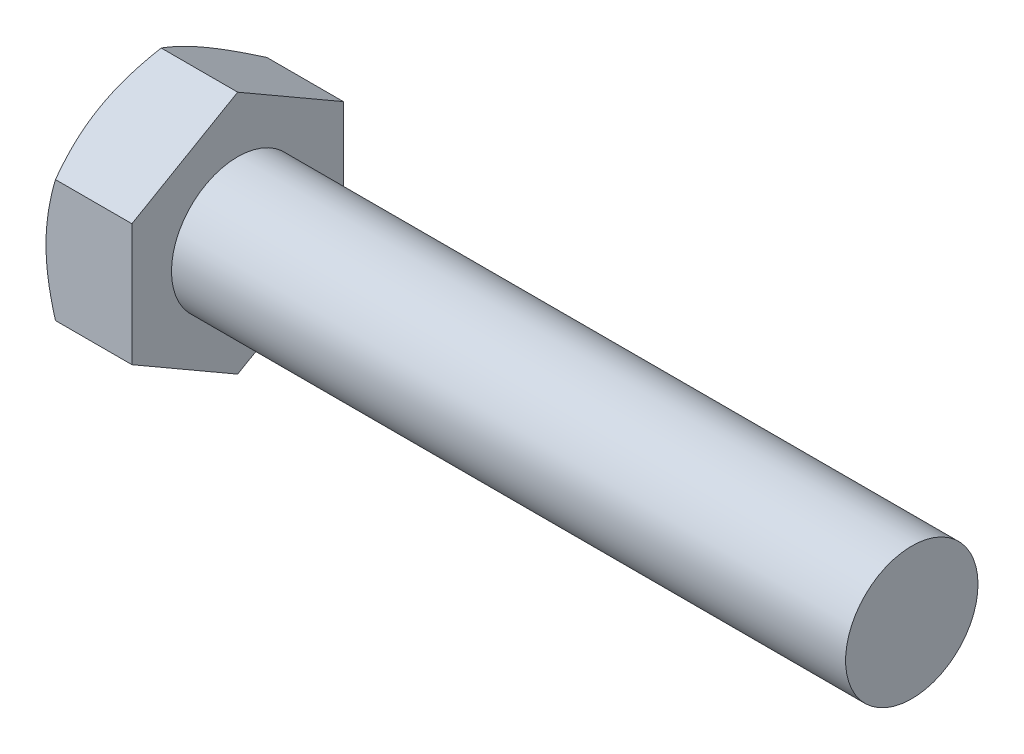
ISO-10303-21;
HEADER;
FILE_DESCRIPTION(('STEP AP214'),'2;1');
FILE_NAME('part.step','',(''),(''),'','','');
FILE_SCHEMA(('AUTOMOTIVE_DESIGN { 1 0 10303 214 1 1 1 1 }'));
ENDSEC;
DATA;
#1=APPLICATION_CONTEXT('core data for automotive mechanical design processes');
#2=APPLICATION_PROTOCOL_DEFINITION('international standard','automotive_design',2000,#1);
#3=PRODUCT_CONTEXT('',#1,'mechanical');
#4=PRODUCT('Part','Part','',(#3));
#5=PRODUCT_RELATED_PRODUCT_CATEGORY('part','',(#4));
#6=PRODUCT_DEFINITION_FORMATION('','',#4);
#7=PRODUCT_DEFINITION_CONTEXT('part definition',#1,'design');
#8=PRODUCT_DEFINITION('design','',#6,#7);
#9=PRODUCT_DEFINITION_SHAPE('','',#8);
#10=(LENGTH_UNIT() NAMED_UNIT(*) SI_UNIT(.MILLI.,.METRE.));
#11=(NAMED_UNIT(*) PLANE_ANGLE_UNIT() SI_UNIT($,.RADIAN.));
#12=(NAMED_UNIT(*) SI_UNIT($,.STERADIAN.) SOLID_ANGLE_UNIT());
#13=UNCERTAINTY_MEASURE_WITH_UNIT(LENGTH_MEASURE(1.E-05),#10,'distance_accuracy_value','');
#14=(GEOMETRIC_REPRESENTATION_CONTEXT(3) GLOBAL_UNCERTAINTY_ASSIGNED_CONTEXT((#13)) GLOBAL_UNIT_ASSIGNED_CONTEXT((#10,
#11,#12)) REPRESENTATION_CONTEXT('',''));
#15=CARTESIAN_POINT('',(0.,0.,0.));
#16=DIRECTION('',(0.,0.,1.));
#17=DIRECTION('',(1.,0.,0.));
#18=AXIS2_PLACEMENT_3D('',#15,#16,#17);
#19=CARTESIAN_POINT('',(-22.8203125,-3.66617420935412,6.35));
#20=DIRECTION('',(0.,0.,-1.));
#21=DIRECTION('',(0.,1.,0.));
#22=AXIS2_PLACEMENT_3D('',#19,#20,#21);
#23=PLANE('',#22);
#24=CARTESIAN_POINT('',(-19.6448084769885,-10.0051578251258,6.35));
#25=CARTESIAN_POINT('',(-19.7806472234139,-9.72641871453256,6.35));
#26=CARTESIAN_POINT('',(-19.9152281142947,-9.44705632305443,6.35));
#27=CARTESIAN_POINT('',(-20.1811696423704,-8.88675404130045,6.35));
#28=CARTESIAN_POINT('',(-20.3125298009689,-8.60581392410908,6.35));
#29=CARTESIAN_POINT('',(-20.5719527378285,-8.04065222508161,6.35));
#30=CARTESIAN_POINT('',(-20.6999949902051,-7.75642118995144,6.35));
#31=CARTESIAN_POINT('',(-20.9510446639286,-7.18575243067033,6.35));
#32=CARTESIAN_POINT('',(-21.0740523132207,-6.89931480712349,6.35));
#33=CARTESIAN_POINT('',(-21.3177725764687,-6.31401786014468,6.35));
#34=CARTESIAN_POINT('',(-21.4382658636132,-6.0150667257098,6.35));
#35=CARTESIAN_POINT('',(-21.67050815396,-5.41372540128068,6.35));
#36=CARTESIAN_POINT('',(-21.7822561984423,-5.11133483838043,6.35));
#37=CARTESIAN_POINT('',(-21.9941899270712,-4.50315126065896,6.35));
#38=CARTESIAN_POINT('',(-22.0943977029784,-4.19736601814086,6.35));
#39=CARTESIAN_POINT('',(-22.2801391243889,-3.58140865935075,6.35));
#40=CARTESIAN_POINT('',(-22.3656772271364,-3.27123790669066,6.35));
#41=CARTESIAN_POINT('',(-22.5176288522021,-2.64806579192565,6.35));
#42=CARTESIAN_POINT('',(-22.5841495757886,-2.33509098307937,6.35));
#43=CARTESIAN_POINT('',(-22.6943950576967,-1.70504553693546,6.35));
#44=CARTESIAN_POINT('',(-22.7381223030166,-1.38797535035514,6.35));
#45=CARTESIAN_POINT('',(-22.7837225842862,-0.912675962009666,6.35));
#46=CARTESIAN_POINT('',(-22.7955764186587,-0.755367038557702,6.35));
#47=CARTESIAN_POINT('',(-22.8126201344209,-0.440381615119715,6.35));
#48=CARTESIAN_POINT('',(-22.8178101309861,-0.282705121533836,6.35));
#49=CARTESIAN_POINT('',(-22.8213945942273,0.0327256239929817,6.35));
#50=CARTESIAN_POINT('',(-22.8197890243312,0.190479876347831,6.35));
#51=CARTESIAN_POINT('',(-22.8098251734955,0.505777218224734,6.35));
#52=CARTESIAN_POINT('',(-22.8014665849363,0.663320297799778,6.35));
#53=CARTESIAN_POINT('',(-22.7737956727625,1.03721532467461,6.35));
#54=CARTESIAN_POINT('',(-22.7515423960211,1.25335459941585,6.35));
#55=CARTESIAN_POINT('',(-22.6955033149472,1.68412111995772,6.35));
#56=CARTESIAN_POINT('',(-22.661716076449,1.89874817433563,6.35));
#57=CARTESIAN_POINT('',(-22.5448374834382,2.54005767892035,6.35));
#58=CARTESIAN_POINT('',(-22.4462469738062,2.96395796144147,6.35));
#59=CARTESIAN_POINT('',(-22.2740754797159,3.59815173246437,6.35));
#60=CARTESIAN_POINT('',(-22.211781614797,3.81169940861779,6.35));
#61=CARTESIAN_POINT('',(-22.0804255131534,4.23672342972448,6.35));
#62=CARTESIAN_POINT('',(-22.0113632240341,4.44819975862948,6.35));
#63=CARTESIAN_POINT('',(-21.8676029868225,4.86914435236874,6.35));
#64=CARTESIAN_POINT('',(-21.7929066144661,5.07861316032889,6.35));
#65=CARTESIAN_POINT('',(-21.6387868438055,5.49579319916624,6.35));
#66=CARTESIAN_POINT('',(-21.5593635552769,5.70350447073178,6.35));
#67=CARTESIAN_POINT('',(-21.3388320441155,6.26416646558949,6.35));
#68=CARTESIAN_POINT('',(-21.1939325203753,6.61562453038353,6.35));
#69=CARTESIAN_POINT('',(-20.8955737480407,7.31490207900984,6.35));
#70=CARTESIAN_POINT('',(-20.7421135353227,7.66272114775062,6.35));
#71=CARTESIAN_POINT('',(-20.428666423217,8.35555939048495,6.35));
#72=CARTESIAN_POINT('',(-20.268677001844,8.70057741965516,6.35));
#73=CARTESIAN_POINT('',(-19.9437388915422,9.38824468336702,6.35));
#74=CARTESIAN_POINT('',(-19.7787904080802,9.73089401532849,6.35));
#75=CARTESIAN_POINT('',(-19.4447462708977,10.4148507460789,6.35));
#76=CARTESIAN_POINT('',(-19.2756443149362,10.7561550603316,6.35));
#77=CARTESIAN_POINT('',(-18.9343584361715,11.4372202754995,6.35));
#78=CARTESIAN_POINT('',(-18.762174487255,11.7769811633068,6.35));
#79=CARTESIAN_POINT('',(-18.4153708031027,12.455159668309,6.35));
#80=CARTESIAN_POINT('',(-18.2407516240083,12.7935775702421,6.35));
#81=CARTESIAN_POINT('',(-17.8894964704939,13.4693656966434,6.35));
#82=CARTESIAN_POINT('',(-17.7128604879573,13.8067359168882,6.35));
#83=CARTESIAN_POINT('',(-17.2182424544001,14.7458348373303,6.35));
#84=CARTESIAN_POINT('',(-16.8984485005033,15.3466090084088,6.35));
#85=CARTESIAN_POINT('',(-16.2550253292289,16.5461439591149,6.35));
#86=CARTESIAN_POINT('',(-15.9313958724886,17.1449046100593,6.35));
#87=CARTESIAN_POINT('',(-15.2823888918912,18.3388504326276,6.35));
#88=CARTESIAN_POINT('',(-14.9570210008409,18.934040845617,6.35));
#89=CARTESIAN_POINT('',(-14.3041046602368,20.1231630021511,6.35));
#90=CARTESIAN_POINT('',(-13.9765563871246,20.7170948425355,6.35));
#91=CARTESIAN_POINT('',(-13.6482164110705,21.3105854625202,6.35));
#92=B_SPLINE_CURVE_WITH_KNOTS('',3,(#24,#25,#26,#27,#28,#29,#30,#31,#32,#33,#34,#35,#36,#37,#38,
#39,#40,#41,#42,#43,#44,#45,#46,#47,#48,#49,#50,#51,#52,#53,#54,#55,#56,#57,#58,#59,#60,#61,#62,
#63,#64,#65,#66,#67,#68,#69,#70,#71,#72,#73,#74,#75,#76,#77,#78,#79,#80,#81,#82,#83,#84,#85,#86,
#87,#88,#89,#90,#91),.UNSPECIFIED.,.F.,.F.,(4,2,2,2,2,2,2,2,2,2,2,2,2,2,2,2,2,2,2,2,2,2,2,2,2,2,
2,2,2,2,2,2,2,4),(0.,0.930241206579808,1.86061981807342,2.79580195408029,3.73094170211174,
4.69779706111132,5.66475826610128,6.62983649690372,7.59462097610561,8.55385459215178,
9.51298352422012,9.98612858474459,10.4592654674842,10.9324048965369,11.4055658796801,
12.0570468048549,12.7086087665508,14.0123635805859,14.6796475701139,15.3469367255037,
16.0140399410946,16.681127670241,17.8214258704029,18.961852753759,20.1027243891645,
21.2435488202467,22.3862266665416,23.5289141991518,24.6713449123072,25.8137802248676,
27.8555177100868,29.8973832922459,31.9323333342056,33.9671206581205),.UNSPECIFIED.);
#93=CARTESIAN_POINT('',(-22.2531533760208,-3.66617420935412,6.35));
#94=VERTEX_POINT('',#93);
#95=CARTESIAN_POINT('',(-22.8203125,0.,6.35));
#96=VERTEX_POINT('',#95);
#97=EDGE_CURVE('E282',#94,#96,#92,.T.);
#98=ORIENTED_EDGE('',*,*,#97,.F.);
#99=DIRECTION('',(1.,0.,0.));
#100=VECTOR('',#99,1.);
#101=CARTESIAN_POINT('',(-22.8203125,-3.66617420935412,6.35));
#102=LINE('',#101,#100);
#103=CARTESIAN_POINT('',(-17.6609375,-3.66617420935412,6.35));
#104=VERTEX_POINT('',#103);
#105=EDGE_CURVE('E258',#94,#104,#102,.T.);
#106=ORIENTED_EDGE('',*,*,#105,.T.);
#107=DIRECTION('',(0.,1.,0.));
#108=VECTOR('',#107,1.);
#109=CARTESIAN_POINT('',(-17.6609375,-3.66617420935412,6.35));
#110=LINE('',#109,#108);
#111=CARTESIAN_POINT('',(-17.6609375,3.66617420935412,6.35));
#112=VERTEX_POINT('',#111);
#113=EDGE_CURVE('E279',#104,#112,#110,.T.);
#114=ORIENTED_EDGE('',*,*,#113,.T.);
#115=DIRECTION('',(1.,0.,0.));
#116=VECTOR('',#115,1.);
#117=CARTESIAN_POINT('',(-22.8203125,3.66617420935412,6.35));
#118=LINE('',#117,#116);
#119=CARTESIAN_POINT('',(-22.2531533760208,3.66617420935412,6.35));
#120=VERTEX_POINT('',#119);
#121=EDGE_CURVE('E242',#120,#112,#118,.T.);
#122=ORIENTED_EDGE('',*,*,#121,.F.);
#123=EDGE_CURVE('E123',#96,#120,#92,.T.);
#124=ORIENTED_EDGE('',*,*,#123,.F.);
#125=EDGE_LOOP('',(#98,#106,#114,#122,#124));
#126=FACE_BOUND('',#125,.T.);
#127=ADVANCED_FACE('F46',(#126),#23,.F.);
#128=CARTESIAN_POINT('',(-22.8203125,3.66617420935412,6.35));
#129=DIRECTION('',(0.,-0.866025403784439,-0.5));
#130=DIRECTION('',(0.,0.5,-0.866025403784439));
#131=AXIS2_PLACEMENT_3D('',#128,#129,#130);
#132=PLANE('',#131);
#133=CARTESIAN_POINT('',(-22.2530867077793,3.66605873930029,6.3502));
#134=CARTESIAN_POINT('',(-22.2996067041145,3.74664547796792,6.21061967421138));
#135=CARTESIAN_POINT('',(-22.3440154674141,3.82753268308249,6.0705189252707));
#136=CARTESIAN_POINT('',(-22.4280290495476,3.98996398524061,5.78917965719326));
#137=CARTESIAN_POINT('',(-22.4676317960239,4.07150834960367,5.64794067504554));
#138=CARTESIAN_POINT('',(-22.5784536761901,4.3174470761041,5.22196230519801));
#139=CARTESIAN_POINT('',(-22.6414880177975,4.48281224427705,4.93554143212029));
#140=CARTESIAN_POINT('',(-22.7154034283044,4.73027821122564,4.50691780422117));
#141=CARTESIAN_POINT('',(-22.7364598320668,4.81163960303488,4.36599573983304));
#142=CARTESIAN_POINT('',(-22.7717684553382,4.97473001999651,4.08351485142791));
#143=CARTESIAN_POINT('',(-22.7860212760328,5.05645901202217,3.94195608478808));
#144=CARTESIAN_POINT('',(-22.8073594957219,5.22005894556885,3.65859268777033));
#145=CARTESIAN_POINT('',(-22.8144530289767,5.30192961988371,3.51678852020707));
#146=CARTESIAN_POINT('',(-22.8213281791715,5.46574208117748,3.23305701433335));
#147=CARTESIAN_POINT('',(-22.8211100219891,5.5476838658814,3.0911296799633));
#148=CARTESIAN_POINT('',(-22.8104619234729,5.77217863345104,2.7022933364993));
#149=CARTESIAN_POINT('',(-22.7925858595915,5.9146581322581,2.45551160552853));
#150=CARTESIAN_POINT('',(-22.7359002941426,6.19867079116019,1.96358725031737));
#151=CARTESIAN_POINT('',(-22.6970714171341,6.34020295240188,1.71844635614173));
#152=CARTESIAN_POINT('',(-22.60001032975,6.6247872026121,1.22553197574375));
#153=CARTESIAN_POINT('',(-22.5413668750407,6.76780338177705,0.977820687125685));
#154=CARTESIAN_POINT('',(-22.4082698312893,7.05170294521182,0.486092219010033));
#155=CARTESIAN_POINT('',(-22.3338475068923,7.19258996539467,0.242068741926356));
#156=CARTESIAN_POINT('',(-22.2530867077793,7.33246388876208,-0.000200000000001382));
#157=B_SPLINE_CURVE_WITH_KNOTS('',3,(#133,#134,#135,#136,#137,#138,#139,#140,#141,#142,#143,
#144,#145,#146,#147,#148,#149,#150,#151,#152,#153,#154,#155,#156),.UNSPECIFIED.,.F.,.F.,(4,2,2,
2,2,2,2,2,2,2,2,4),(0.,0.503218195050232,1.00665261286994,2.01561339063536,2.50773694105499,
2.99981699787609,3.49133733019735,3.9828424781586,4.83850206575152,5.69495425638522,
6.57040160519864,7.44413026658512),.UNSPECIFIED.);
#158=CARTESIAN_POINT('',(-22.8203125,5.49926131403119,3.175));
#159=VERTEX_POINT('',#158);
#160=EDGE_CURVE('E119',#120,#159,#157,.T.);
#161=ORIENTED_EDGE('',*,*,#160,.F.);
#162=ORIENTED_EDGE('',*,*,#121,.T.);
#163=DIRECTION('',(0.,0.5,-0.866025403784439));
#164=VECTOR('',#163,1.);
#165=CARTESIAN_POINT('',(-17.6609375,3.66617420935412,6.35));
#166=LINE('',#165,#164);
#167=CARTESIAN_POINT('',(-17.6609375,7.33234841870825,0.));
#168=VERTEX_POINT('',#167);
#169=EDGE_CURVE('E277',#112,#168,#166,.T.);
#170=ORIENTED_EDGE('',*,*,#169,.T.);
#171=DIRECTION('',(1.,0.,0.));
#172=VECTOR('',#171,1.);
#173=CARTESIAN_POINT('',(-22.8203125,7.33234841870825,0.));
#174=LINE('',#173,#172);
#175=CARTESIAN_POINT('',(-22.2531533760208,7.33234841870825,0.));
#176=VERTEX_POINT('',#175);
#177=EDGE_CURVE('E144',#176,#168,#174,.T.);
#178=ORIENTED_EDGE('',*,*,#177,.F.);
#179=EDGE_CURVE('E128',#159,#176,#157,.T.);
#180=ORIENTED_EDGE('',*,*,#179,.F.);
#181=EDGE_LOOP('',(#161,#162,#170,#178,#180));
#182=FACE_BOUND('',#181,.T.);
#183=ADVANCED_FACE('F142',(#182),#132,.F.);
#184=CARTESIAN_POINT('',(-22.8203125,7.33234841870825,0.));
#185=DIRECTION('',(0.,-0.866025403784439,0.5));
#186=DIRECTION('',(0.,-0.5,-0.866025403784439));
#187=AXIS2_PLACEMENT_3D('',#184,#185,#186);
#188=PLANE('',#187);
#189=CARTESIAN_POINT('',(-22.2530867077793,7.33246388876208,0.000199999999998837));
#190=CARTESIAN_POINT('',(-22.2996067041145,7.25187715009445,-0.139380325788621));
#191=CARTESIAN_POINT('',(-22.3440154674141,7.17098994497988,-0.279481074729296));
#192=CARTESIAN_POINT('',(-22.4280290495476,7.00855864282176,-0.560820342806735));
#193=CARTESIAN_POINT('',(-22.4676317960239,6.9270142784587,-0.702059324954461));
#194=CARTESIAN_POINT('',(-22.5784536761901,6.68107555195827,-1.12803769480199));
#195=CARTESIAN_POINT('',(-22.6414880177975,6.51571038378532,-1.41445856787971));
#196=CARTESIAN_POINT('',(-22.7154034283044,6.26824441683673,-1.84308219577883));
#197=CARTESIAN_POINT('',(-22.7364598320668,6.18688302502749,-1.98400426016696));
#198=CARTESIAN_POINT('',(-22.7717684553382,6.02379260806586,-2.26648514857209));
#199=CARTESIAN_POINT('',(-22.7860212760328,5.9420636160402,-2.40804391521192));
#200=CARTESIAN_POINT('',(-22.8073594957219,5.77846368249352,-2.69140731222967));
#201=CARTESIAN_POINT('',(-22.8144530289767,5.69659300817866,-2.83321147979293));
#202=CARTESIAN_POINT('',(-22.8213281791715,5.53278054688489,-3.11694298566665));
#203=CARTESIAN_POINT('',(-22.8211100219891,5.45083876218097,-3.2588703200367));
#204=CARTESIAN_POINT('',(-22.8104619234729,5.22634399461133,-3.6477066635007));
#205=CARTESIAN_POINT('',(-22.7925858595915,5.08386449580427,-3.89448839447147));
#206=CARTESIAN_POINT('',(-22.7359002941426,4.79985183690218,-4.38641274968263));
#207=CARTESIAN_POINT('',(-22.6970714171341,4.65831967566049,-4.63155364385826));
#208=CARTESIAN_POINT('',(-22.60001032975,4.37373542545027,-5.12446802425625));
#209=CARTESIAN_POINT('',(-22.5413668750407,4.23071924628532,-5.37217931287431));
#210=CARTESIAN_POINT('',(-22.4082698312893,3.94681968285055,-5.86390778098997));
#211=CARTESIAN_POINT('',(-22.3338475068923,3.8059326626677,-6.10793125807364));
#212=CARTESIAN_POINT('',(-22.2530867077793,3.66605873930029,-6.3502));
#213=B_SPLINE_CURVE_WITH_KNOTS('',3,(#189,#190,#191,#192,#193,#194,#195,#196,#197,#198,#199,
#200,#201,#202,#203,#204,#205,#206,#207,#208,#209,#210,#211,#212),.UNSPECIFIED.,.F.,.F.,(4,2,2,
2,2,2,2,2,2,2,2,4),(0.,0.503218195050231,1.00665261286994,2.01561339063536,2.50773694105499,
2.99981699787609,3.49133733019735,3.9828424781586,4.83850206575152,5.69495425638522,
6.57040160519864,7.44413026658512),.UNSPECIFIED.);
#214=CARTESIAN_POINT('',(-22.8203125,5.49926131403119,-3.175));
#215=VERTEX_POINT('',#214);
#216=EDGE_CURVE('E133',#176,#215,#213,.T.);
#217=ORIENTED_EDGE('',*,*,#216,.F.);
#218=ORIENTED_EDGE('',*,*,#177,.T.);
#219=DIRECTION('',(0.,-0.5,-0.866025403784439));
#220=VECTOR('',#219,1.);
#221=CARTESIAN_POINT('',(-17.6609375,7.33234841870825,0.));
#222=LINE('',#221,#220);
#223=CARTESIAN_POINT('',(-17.6609375,3.66617420935412,-6.35));
#224=VERTEX_POINT('',#223);
#225=EDGE_CURVE('E273',#168,#224,#222,.T.);
#226=ORIENTED_EDGE('',*,*,#225,.T.);
#227=DIRECTION('',(1.,0.,0.));
#228=VECTOR('',#227,1.);
#229=CARTESIAN_POINT('',(-22.8203125,3.66617420935412,-6.35));
#230=LINE('',#229,#228);
#231=CARTESIAN_POINT('',(-22.2531533760208,3.66617420935412,-6.35));
#232=VERTEX_POINT('',#231);
#233=EDGE_CURVE('E249',#232,#224,#230,.T.);
#234=ORIENTED_EDGE('',*,*,#233,.F.);
#235=EDGE_CURVE('E147',#215,#232,#213,.T.);
#236=ORIENTED_EDGE('',*,*,#235,.F.);
#237=EDGE_LOOP('',(#217,#218,#226,#234,#236));
#238=FACE_BOUND('',#237,.T.);
#239=ADVANCED_FACE('F208',(#238),#188,.F.);
#240=CARTESIAN_POINT('',(-22.8203125,3.66617420935412,-6.35));
#241=DIRECTION('',(0.,0.,1.));
#242=DIRECTION('',(0.,-1.,0.));
#243=AXIS2_PLACEMENT_3D('',#240,#241,#242);
#244=PLANE('',#243);
#245=CARTESIAN_POINT('',(-19.6448084802712,-10.0051578183916,-6.35));
#246=CARTESIAN_POINT('',(-19.7806472265598,-9.72641870802509,-6.35));
#247=CARTESIAN_POINT('',(-19.9152281173039,-9.44705631677388,-6.35));
#248=CARTESIAN_POINT('',(-20.181169645107,-8.88675403547444,-6.35));
#249=CARTESIAN_POINT('',(-20.3125298035695,-8.60581391851068,-6.35));
#250=CARTESIAN_POINT('',(-20.571952740157,-8.04065221994183,-6.35));
#251=CARTESIAN_POINT('',(-20.6999949923975,-7.7564211850427,-6.35));
#252=CARTESIAN_POINT('',(-20.9510446658511,-7.18575242622521,-6.35));
#253=CARTESIAN_POINT('',(-21.0740523150094,-6.89931480291096,-6.35));
#254=CARTESIAN_POINT('',(-21.3177725779857,-6.31401785641581,-6.35));
#255=CARTESIAN_POINT('',(-21.4382658649925,-6.01506672223218,-6.35));
#256=CARTESIAN_POINT('',(-21.6705081550713,-5.41372539830956,-6.35));
#257=CARTESIAN_POINT('',(-21.7822561994232,-5.11133483566456,-6.35));
#258=CARTESIAN_POINT('',(-21.9941899278037,-4.50315125845829,-6.35));
#259=CARTESIAN_POINT('',(-22.0943977035928,-4.19736601620014,-6.35));
#260=CARTESIAN_POINT('',(-22.2801391247861,-3.58140865793696,-6.35));
#261=CARTESIAN_POINT('',(-22.3656772274346,-3.27123790554385,-6.35));
#262=CARTESIAN_POINT('',(-22.5176288523001,-2.64806579144828,-6.35));
#263=CARTESIAN_POINT('',(-22.5841495757929,-2.3350909830063,-6.35));
#264=CARTESIAN_POINT('',(-22.6943950575746,-1.70504553768108,-6.35));
#265=CARTESIAN_POINT('',(-22.7381223028617,-1.38797535151515,-6.35));
#266=CARTESIAN_POINT('',(-22.7837225841371,-0.912675963788459,-6.35));
#267=CARTESIAN_POINT('',(-22.7955764185206,-0.75536704053973,-6.35));
#268=CARTESIAN_POINT('',(-22.8126201343226,-0.440381617507908,-6.35));
#269=CARTESIAN_POINT('',(-22.8178101309166,-0.282705124124961,-6.35));
#270=CARTESIAN_POINT('',(-22.8213945942333,0.0327256209974697,-6.35));
#271=CARTESIAN_POINT('',(-22.8197890243838,0.190479873150863,-6.35));
#272=CARTESIAN_POINT('',(-22.8098251736577,0.50577721462744,-6.35));
#273=CARTESIAN_POINT('',(-22.8014665851615,0.663320294003615,-6.35));
#274=CARTESIAN_POINT('',(-22.7737956731426,1.03721532057395,-6.35));
#275=CARTESIAN_POINT('',(-22.7515423964902,1.25335459521043,-6.35));
#276=CARTESIAN_POINT('',(-22.695503315599,1.68412111554759,-6.35));
#277=CARTESIAN_POINT('',(-22.6617160771945,1.89874816982555,-6.35));
#278=CARTESIAN_POINT('',(-22.5448374844667,2.54005767411599,-6.35));
#279=CARTESIAN_POINT('',(-22.4462469750258,2.96395795644879,-6.35));
#280=CARTESIAN_POINT('',(-22.2740754812174,3.59815172719005,-6.35));
#281=CARTESIAN_POINT('',(-22.2117816163931,3.81169940324754,-6.35));
#282=CARTESIAN_POINT('',(-22.0804255149357,4.23672342416346,-6.35));
#283=CARTESIAN_POINT('',(-22.011363225908,4.44819975297362,-6.35));
#284=CARTESIAN_POINT('',(-21.8676029888762,4.86914434652396,-6.35));
#285=CARTESIAN_POINT('',(-21.7929066166081,5.07861315439,-6.35));
#286=CARTESIAN_POINT('',(-21.6387868461209,5.49579319303915,-6.35));
#287=CARTESIAN_POINT('',(-21.5593635576775,5.70350446451057,-6.35));
#288=CARTESIAN_POINT('',(-21.3388320466631,6.26416645931566,-6.35));
#289=CARTESIAN_POINT('',(-21.1939325229753,6.61562452414836,-6.35));
#290=CARTESIAN_POINT('',(-20.8955737507304,7.31490207284698,-6.35));
#291=CARTESIAN_POINT('',(-20.7421135380495,7.6627211416214,-6.35));
#292=CARTESIAN_POINT('',(-20.4286664260072,8.35555938441945,-6.35));
#293=CARTESIAN_POINT('',(-20.2686770046602,8.70057741361971,-6.35));
#294=CARTESIAN_POINT('',(-19.9437388944028,9.38824467738844,-6.35));
#295=CARTESIAN_POINT('',(-19.7787904109591,9.7308940093767,-6.35));
#296=CARTESIAN_POINT('',(-19.4447462738067,10.4148507401799,-6.35));
#297=CARTESIAN_POINT('',(-19.275644317857,10.7561550544587,-6.35));
#298=CARTESIAN_POINT('',(-18.9343584391116,11.4372202696767,-6.35));
#299=CARTESIAN_POINT('',(-18.7621744902026,11.7769811575081,-6.35));
#300=CARTESIAN_POINT('',(-18.4153708060622,12.4551596625566,-6.35));
#301=CARTESIAN_POINT('',(-18.2407516269722,12.793577564512,-6.35));
#302=CARTESIAN_POINT('',(-17.8894964734642,13.4693656909567,-6.35));
#303=CARTESIAN_POINT('',(-17.7128604909295,13.8067359112226,-6.35));
#304=CARTESIAN_POINT('',(-17.2182424573938,14.7458348316867,-6.35));
#305=CARTESIAN_POINT('',(-16.8984485035148,15.3466090027653,-6.35));
#306=CARTESIAN_POINT('',(-16.2550253322724,16.5461439534699,-6.35));
#307=CARTESIAN_POINT('',(-15.9313958755463,17.1449046044126,-6.35));
#308=CARTESIAN_POINT('',(-15.2823888949781,18.3388504269704,-6.35));
#309=CARTESIAN_POINT('',(-14.9570210039428,18.9340408399509,-6.35));
#310=CARTESIAN_POINT('',(-14.3041046633672,20.123162996466,-6.35));
#311=CARTESIAN_POINT('',(-13.9765563902684,20.7170948368404,-6.35));
#312=CARTESIAN_POINT('',(-13.6482164142273,21.3105854568149,-6.35));
#313=B_SPLINE_CURVE_WITH_KNOTS('',3,(#245,#246,#247,#248,#249,#250,#251,#252,#253,#254,#255,
#256,#257,#258,#259,#260,#261,#262,#263,#264,#265,#266,#267,#268,#269,#270,#271,#272,#273,#274,
#275,#276,#277,#278,#279,#280,#281,#282,#283,#284,#285,#286,#287,#288,#289,#290,#291,#292,#293,
#294,#295,#296,#297,#298,#299,#300,#301,#302,#303,#304,#305,#306,#307,#308,#309,#310,#311,#312),
.UNSPECIFIED.,.F.,.F.,(4,2,2,2,2,2,2,2,2,2,2,2,2,2,2,2,2,2,2,2,2,2,2,2,2,2,2,2,2,2,2,2,2,4),(0.,
0.930241205788528,1.86061981649075,2.79580195169803,3.73094169892995,4.69779705707614,
5.66475826121242,6.62983649116392,7.59462096951554,8.55385458431944,9.51298351514732,
9.98612857506677,10.4592654572014,10.9324048856488,11.4055658681868,12.0570467930218,
12.7086087543779,14.0123635677318,14.6796475569039,15.3469367119378,16.0140399271738,
16.6811276559652,17.8214258561736,18.9618527395769,20.1027243750311,21.2435488061617,
22.3862266525109,23.5289141851753,24.6713448983841,25.8137802109978,27.855517696192,
29.8973832783267,31.9323333202412,33.9671206441104),.UNSPECIFIED.);
#314=CARTESIAN_POINT('',(-22.8203125,0.,-6.35));
#315=VERTEX_POINT('',#314);
#316=EDGE_CURVE('E202',#232,#315,#313,.F.);
#317=ORIENTED_EDGE('',*,*,#316,.F.);
#318=ORIENTED_EDGE('',*,*,#233,.T.);
#319=DIRECTION('',(0.,-1.,0.));
#320=VECTOR('',#319,1.);
#321=CARTESIAN_POINT('',(-17.6609375,3.66617420935412,-6.35));
#322=LINE('',#321,#320);
#323=CARTESIAN_POINT('',(-17.6609375,-3.66617420935412,-6.35));
#324=VERTEX_POINT('',#323);
#325=EDGE_CURVE('E269',#224,#324,#322,.T.);
#326=ORIENTED_EDGE('',*,*,#325,.T.);
#327=DIRECTION('',(1.,0.,0.));
#328=VECTOR('',#327,1.);
#329=CARTESIAN_POINT('',(-22.8203125,-3.66617420935412,-6.35));
#330=LINE('',#329,#328);
#331=CARTESIAN_POINT('',(-22.2531533760208,-3.66617420935412,-6.35));
#332=VERTEX_POINT('',#331);
#333=EDGE_CURVE('E252',#332,#324,#330,.T.);
#334=ORIENTED_EDGE('',*,*,#333,.F.);
#335=EDGE_CURVE('E195',#315,#332,#313,.F.);
#336=ORIENTED_EDGE('',*,*,#335,.F.);
#337=EDGE_LOOP('',(#317,#318,#326,#334,#336));
#338=FACE_BOUND('',#337,.T.);
#339=ADVANCED_FACE('F204',(#338),#244,.F.);
#340=CARTESIAN_POINT('',(-22.8203125,-3.66617420935412,-6.35));
#341=DIRECTION('',(0.,0.866025403784439,0.5));
#342=DIRECTION('',(0.,-0.5,0.866025403784439));
#343=AXIS2_PLACEMENT_3D('',#340,#341,#342);
#344=PLANE('',#343);
#345=CARTESIAN_POINT('',(-22.2530867077793,-3.66605873930029,-6.3502));
#346=CARTESIAN_POINT('',(-22.2996067041145,-3.74664547796792,-6.21061967421138));
#347=CARTESIAN_POINT('',(-22.3440154674141,-3.82753268308249,-6.0705189252707));
#348=CARTESIAN_POINT('',(-22.4280290495476,-3.98996398524061,-5.78917965719326));
#349=CARTESIAN_POINT('',(-22.4676317960239,-4.07150834960367,-5.64794067504554));
#350=CARTESIAN_POINT('',(-22.5784536761901,-4.3174470761041,-5.22196230519801));
#351=CARTESIAN_POINT('',(-22.6414880177975,-4.48281224427705,-4.93554143212029));
#352=CARTESIAN_POINT('',(-22.7154034283044,-4.73027821122564,-4.50691780422117));
#353=CARTESIAN_POINT('',(-22.7364598320668,-4.81163960303488,-4.36599573983304));
#354=CARTESIAN_POINT('',(-22.7717684553382,-4.97473001999651,-4.08351485142791));
#355=CARTESIAN_POINT('',(-22.7860212760328,-5.05645901202217,-3.94195608478808));
#356=CARTESIAN_POINT('',(-22.8073594957219,-5.22005894556885,-3.65859268777033));
#357=CARTESIAN_POINT('',(-22.8144530289767,-5.30192961988371,-3.51678852020707));
#358=CARTESIAN_POINT('',(-22.8213281791715,-5.46574208117748,-3.23305701433335));
#359=CARTESIAN_POINT('',(-22.8211100219891,-5.5476838658814,-3.0911296799633));
#360=CARTESIAN_POINT('',(-22.8104619234729,-5.77217863345104,-2.7022933364993));
#361=CARTESIAN_POINT('',(-22.7925858595915,-5.9146581322581,-2.45551160552853));
#362=CARTESIAN_POINT('',(-22.7359002941426,-6.19867079116019,-1.96358725031737));
#363=CARTESIAN_POINT('',(-22.6970714171341,-6.34020295240189,-1.71844635614173));
#364=CARTESIAN_POINT('',(-22.60001032975,-6.6247872026121,-1.22553197574375));
#365=CARTESIAN_POINT('',(-22.5413668750407,-6.76780338177705,-0.977820687125687));
#366=CARTESIAN_POINT('',(-22.4082698312893,-7.05170294521182,-0.486092219010035));
#367=CARTESIAN_POINT('',(-22.3338475068923,-7.19258996539467,-0.242068741926358));
#368=CARTESIAN_POINT('',(-22.2530867077793,-7.33246388876208,0.000199999999998287));
#369=B_SPLINE_CURVE_WITH_KNOTS('',3,(#345,#346,#347,#348,#349,#350,#351,#352,#353,#354,#355,
#356,#357,#358,#359,#360,#361,#362,#363,#364,#365,#366,#367,#368),.UNSPECIFIED.,.F.,.F.,(4,2,2,
2,2,2,2,2,2,2,2,4),(0.,0.503218195050231,1.00665261286994,2.01561339063536,2.50773694105499,
2.99981699787608,3.49133733019735,3.9828424781586,4.83850206575152,5.69495425638522,
6.57040160519864,7.44413026658512),.UNSPECIFIED.);
#370=CARTESIAN_POINT('',(-22.8203125,-5.49926131403118,-3.175));
#371=VERTEX_POINT('',#370);
#372=EDGE_CURVE('E203',#332,#371,#369,.T.);
#373=ORIENTED_EDGE('',*,*,#372,.F.);
#374=ORIENTED_EDGE('',*,*,#333,.T.);
#375=DIRECTION('',(0.,-0.5,0.866025403784439));
#376=VECTOR('',#375,1.);
#377=CARTESIAN_POINT('',(-17.6609375,-3.66617420935412,-6.35));
#378=LINE('',#377,#376);
#379=CARTESIAN_POINT('',(-17.6609375,-7.33234841870825,0.));
#380=VERTEX_POINT('',#379);
#381=EDGE_CURVE('E265',#324,#380,#378,.T.);
#382=ORIENTED_EDGE('',*,*,#381,.T.);
#383=DIRECTION('',(1.,0.,0.));
#384=VECTOR('',#383,1.);
#385=CARTESIAN_POINT('',(-22.8203125,-7.33234841870825,0.));
#386=LINE('',#385,#384);
#387=CARTESIAN_POINT('',(-22.2531533760208,-7.33234841870825,0.));
#388=VERTEX_POINT('',#387);
#389=EDGE_CURVE('E255',#388,#380,#386,.T.);
#390=ORIENTED_EDGE('',*,*,#389,.F.);
#391=EDGE_CURVE('E189',#371,#388,#369,.T.);
#392=ORIENTED_EDGE('',*,*,#391,.F.);
#393=EDGE_LOOP('',(#373,#374,#382,#390,#392));
#394=FACE_BOUND('',#393,.T.);
#395=ADVANCED_FACE('F207',(#394),#344,.F.);
#396=CARTESIAN_POINT('',(-22.8203125,-7.33234841870825,0.));
#397=DIRECTION('',(0.,0.866025403784439,-0.5));
#398=DIRECTION('',(0.,0.5,0.866025403784439));
#399=AXIS2_PLACEMENT_3D('',#396,#397,#398);
#400=PLANE('',#399);
#401=CARTESIAN_POINT('',(-22.2530867077793,-7.33246388876208,-0.000200000000001518));
#402=CARTESIAN_POINT('',(-22.2996067041145,-7.25187715009445,0.139380325788619));
#403=CARTESIAN_POINT('',(-22.3440154674141,-7.17098994497988,0.279481074729294));
#404=CARTESIAN_POINT('',(-22.4280290495476,-7.00855864282176,0.560820342806734));
#405=CARTESIAN_POINT('',(-22.4676317960239,-6.9270142784587,0.70205932495446));
#406=CARTESIAN_POINT('',(-22.5784536761901,-6.68107555195827,1.12803769480199));
#407=CARTESIAN_POINT('',(-22.6414880177975,-6.51571038378532,1.41445856787971));
#408=CARTESIAN_POINT('',(-22.7154034283044,-6.26824441683674,1.84308219577883));
#409=CARTESIAN_POINT('',(-22.7364598320668,-6.18688302502749,1.98400426016695));
#410=CARTESIAN_POINT('',(-22.7717684553382,-6.02379260806586,2.26648514857209));
#411=CARTESIAN_POINT('',(-22.7860212760328,-5.94206361604021,2.40804391521192));
#412=CARTESIAN_POINT('',(-22.8073594957219,-5.77846368249352,2.69140731222966));
#413=CARTESIAN_POINT('',(-22.8144530289767,-5.69659300817866,2.83321147979293));
#414=CARTESIAN_POINT('',(-22.8213281791715,-5.53278054688489,3.11694298566665));
#415=CARTESIAN_POINT('',(-22.8211100219891,-5.45083876218098,3.2588703200367));
#416=CARTESIAN_POINT('',(-22.8104619234729,-5.22634399461133,3.64770666350069));
#417=CARTESIAN_POINT('',(-22.7925858595915,-5.08386449580427,3.89448839447147));
#418=CARTESIAN_POINT('',(-22.7359002941426,-4.79985183690218,4.38641274968262));
#419=CARTESIAN_POINT('',(-22.6970714171341,-4.65831967566049,4.63155364385826));
#420=CARTESIAN_POINT('',(-22.60001032975,-4.37373542545027,5.12446802425625));
#421=CARTESIAN_POINT('',(-22.5413668750407,-4.23071924628532,5.37217931287431));
#422=CARTESIAN_POINT('',(-22.4082698312893,-3.94681968285055,5.86390778098997));
#423=CARTESIAN_POINT('',(-22.3338475068923,-3.8059326626677,6.10793125807364));
#424=CARTESIAN_POINT('',(-22.2530867077793,-3.66605873930029,6.3502));
#425=B_SPLINE_CURVE_WITH_KNOTS('',3,(#401,#402,#403,#404,#405,#406,#407,#408,#409,#410,#411,
#412,#413,#414,#415,#416,#417,#418,#419,#420,#421,#422,#423,#424),.UNSPECIFIED.,.F.,.F.,(4,2,2,
2,2,2,2,2,2,2,2,4),(0.,0.503218195050232,1.00665261286994,2.01561339063536,2.50773694105499,
2.99981699787609,3.49133733019735,3.9828424781586,4.83850206575152,5.69495425638523,
6.57040160519864,7.44413026658513),.UNSPECIFIED.);
#426=CARTESIAN_POINT('',(-22.8203125,-5.49926131403119,3.175));
#427=VERTEX_POINT('',#426);
#428=EDGE_CURVE('E317',#388,#427,#425,.T.);
#429=ORIENTED_EDGE('',*,*,#428,.F.);
#430=ORIENTED_EDGE('',*,*,#389,.T.);
#431=DIRECTION('',(0.,0.5,0.866025403784439));
#432=VECTOR('',#431,1.);
#433=CARTESIAN_POINT('',(-17.6609375,-7.33234841870825,0.));
#434=LINE('',#433,#432);
#435=EDGE_CURVE('E261',#380,#104,#434,.T.);
#436=ORIENTED_EDGE('',*,*,#435,.T.);
#437=ORIENTED_EDGE('',*,*,#105,.F.);
#438=EDGE_CURVE('E139',#427,#94,#425,.T.);
#439=ORIENTED_EDGE('',*,*,#438,.F.);
#440=EDGE_LOOP('',(#429,#430,#436,#437,#439));
#441=FACE_BOUND('',#440,.T.);
#442=ADVANCED_FACE('F231',(#441),#400,.F.);
#443=CARTESIAN_POINT('',(-17.6609375,0.,0.));
#444=DIRECTION('',(1.,0.,0.));
#445=DIRECTION('',(0.,0.,-1.));
#446=AXIS2_PLACEMENT_3D('',#443,#444,#445);
#447=CYLINDRICAL_SURFACE('',#446,3.9751);
#448=CARTESIAN_POINT('',(-17.6609375,0.,0.));
#449=DIRECTION('',(-1.,0.,0.));
#450=DIRECTION('',(0.,0.,1.));
#451=AXIS2_PLACEMENT_3D('',#448,#449,#450);
#452=CIRCLE('',#451,3.9751);
#453=CARTESIAN_POINT('',(-17.6609375,0.,3.9751));
#454=VERTEX_POINT('',#453);
#455=EDGE_CURVE('E238',#454,#454,#452,.F.);
#456=ORIENTED_EDGE('',*,*,#455,.T.);
#457=EDGE_LOOP('',(#456));
#458=FACE_BOUND('',#457,.T.);
#459=CARTESIAN_POINT('',(22.8203125,0.,0.));
#460=DIRECTION('',(1.,0.,0.));
#461=DIRECTION('',(0.,0.,-1.));
#462=AXIS2_PLACEMENT_3D('',#459,#460,#461);
#463=CIRCLE('',#462,3.9751);
#464=CARTESIAN_POINT('',(22.8203125,0.,-3.9751));
#465=VERTEX_POINT('',#464);
#466=EDGE_CURVE('E235',#465,#465,#463,.T.);
#467=ORIENTED_EDGE('',*,*,#466,.F.);
#468=EDGE_LOOP('',(#467));
#469=FACE_BOUND('',#468,.T.);
#470=ADVANCED_FACE('F48',(#458,#469),#447,.T.);
#471=CARTESIAN_POINT('',(22.8203125,0.,0.));
#472=DIRECTION('',(1.,0.,0.));
#473=DIRECTION('',(0.,0.,-1.));
#474=AXIS2_PLACEMENT_3D('',#471,#472,#473);
#475=PLANE('',#474);
#476=ORIENTED_EDGE('',*,*,#466,.T.);
#477=EDGE_LOOP('',(#476));
#478=FACE_BOUND('',#477,.T.);
#479=ADVANCED_FACE('F224',(#478),#475,.T.);
#480=CARTESIAN_POINT('',(-17.6609375,3.66617420935412,6.35));
#481=DIRECTION('',(-1.,0.,0.));
#482=DIRECTION('',(0.,0.,1.));
#483=AXIS2_PLACEMENT_3D('',#480,#481,#482);
#484=PLANE('',#483);
#485=ORIENTED_EDGE('',*,*,#455,.F.);
#486=EDGE_LOOP('',(#485));
#487=FACE_BOUND('',#486,.T.);
#488=ORIENTED_EDGE('',*,*,#113,.F.);
#489=ORIENTED_EDGE('',*,*,#435,.F.);
#490=ORIENTED_EDGE('',*,*,#381,.F.);
#491=ORIENTED_EDGE('',*,*,#325,.F.);
#492=ORIENTED_EDGE('',*,*,#225,.F.);
#493=ORIENTED_EDGE('',*,*,#169,.F.);
#494=EDGE_LOOP('',(#488,#489,#490,#491,#492,#493));
#495=FACE_BOUND('',#494,.T.);
#496=ADVANCED_FACE('F174',(#487,#495),#484,.F.);
#497=CARTESIAN_POINT('',(-22.8203125,0.,0.));
#498=DIRECTION('',(1.,0.,0.));
#499=DIRECTION('',(0.,0.,1.));
#500=AXIS2_PLACEMENT_3D('',#497,#498,#499);
#501=CONICAL_SURFACE('',#500,6.35,1.0471975511966);
#502=ORIENTED_EDGE('',*,*,#97,.T.);
#503=CARTESIAN_POINT('',(-22.8203125,0.,0.));
#504=DIRECTION('',(-1.,0.,0.));
#505=DIRECTION('',(0.,0.,1.));
#506=AXIS2_PLACEMENT_3D('',#503,#504,#505);
#507=CIRCLE('',#506,6.35);
#508=EDGE_CURVE('E50',#427,#96,#507,.T.);
#509=ORIENTED_EDGE('',*,*,#508,.F.);
#510=ORIENTED_EDGE('',*,*,#438,.T.);
#511=EDGE_LOOP('',(#502,#509,#510));
#512=FACE_BOUND('',#511,.T.);
#513=ADVANCED_FACE('F169',(#512),#501,.T.);
#514=ORIENTED_EDGE('',*,*,#391,.T.);
#515=ORIENTED_EDGE('',*,*,#428,.T.);
#516=EDGE_CURVE('E71',#371,#427,#507,.T.);
#517=ORIENTED_EDGE('',*,*,#516,.F.);
#518=EDGE_LOOP('',(#514,#515,#517));
#519=FACE_BOUND('',#518,.T.);
#520=ADVANCED_FACE('F173',(#519),#501,.T.);
#521=ORIENTED_EDGE('',*,*,#335,.T.);
#522=ORIENTED_EDGE('',*,*,#372,.T.);
#523=EDGE_CURVE('E307',#315,#371,#507,.T.);
#524=ORIENTED_EDGE('',*,*,#523,.F.);
#525=EDGE_LOOP('',(#521,#522,#524));
#526=FACE_BOUND('',#525,.T.);
#527=ADVANCED_FACE('F308',(#526),#501,.T.);
#528=ORIENTED_EDGE('',*,*,#235,.T.);
#529=ORIENTED_EDGE('',*,*,#316,.T.);
#530=EDGE_CURVE('E56',#215,#315,#507,.T.);
#531=ORIENTED_EDGE('',*,*,#530,.F.);
#532=EDGE_LOOP('',(#528,#529,#531));
#533=FACE_BOUND('',#532,.T.);
#534=ADVANCED_FACE('F304',(#533),#501,.T.);
#535=ORIENTED_EDGE('',*,*,#179,.T.);
#536=ORIENTED_EDGE('',*,*,#216,.T.);
#537=EDGE_CURVE('E12',#159,#215,#507,.T.);
#538=ORIENTED_EDGE('',*,*,#537,.F.);
#539=EDGE_LOOP('',(#535,#536,#538));
#540=FACE_BOUND('',#539,.T.);
#541=ADVANCED_FACE('F131',(#540),#501,.T.);
#542=ORIENTED_EDGE('',*,*,#123,.T.);
#543=ORIENTED_EDGE('',*,*,#160,.T.);
#544=CARTESIAN_POINT('',(-22.8203125,0.,0.));
#545=DIRECTION('',(-1.,0.,0.));
#546=DIRECTION('',(0.,0.,1.));
#547=AXIS2_PLACEMENT_3D('',#544,#545,#546);
#548=CIRCLE('',#547,6.35);
#549=EDGE_CURVE('E63',#96,#159,#548,.T.);
#550=ORIENTED_EDGE('',*,*,#549,.F.);
#551=EDGE_LOOP('',(#542,#543,#550));
#552=FACE_BOUND('',#551,.T.);
#553=ADVANCED_FACE('F121',(#552),#501,.T.);
#554=CARTESIAN_POINT('',(-22.8203125,3.66617420935412,6.35));
#555=DIRECTION('',(-1.,0.,0.));
#556=DIRECTION('',(0.,0.,1.));
#557=AXIS2_PLACEMENT_3D('',#554,#555,#556);
#558=PLANE('',#557);
#559=ORIENTED_EDGE('',*,*,#508,.T.);
#560=ORIENTED_EDGE('',*,*,#549,.T.);
#561=ORIENTED_EDGE('',*,*,#537,.T.);
#562=ORIENTED_EDGE('',*,*,#530,.T.);
#563=ORIENTED_EDGE('',*,*,#523,.T.);
#564=ORIENTED_EDGE('',*,*,#516,.T.);
#565=EDGE_LOOP('',(#559,#560,#561,#562,#563,#564));
#566=FACE_BOUND('',#565,.T.);
#567=ADVANCED_FACE('F137',(#566),#558,.T.);
#568=CLOSED_SHELL('',(#127,#183,#239,#339,#395,#442,#470,#479,#496,#513,#520,#527,#534,#541,
#553,#567));
#569=MANIFOLD_SOLID_BREP('B2',#568);
#570=ADVANCED_BREP_SHAPE_REPRESENTATION('',(#18,#569),#14);
#571=SHAPE_DEFINITION_REPRESENTATION(#9,#570);
ENDSEC;
END-ISO-10303-21;
